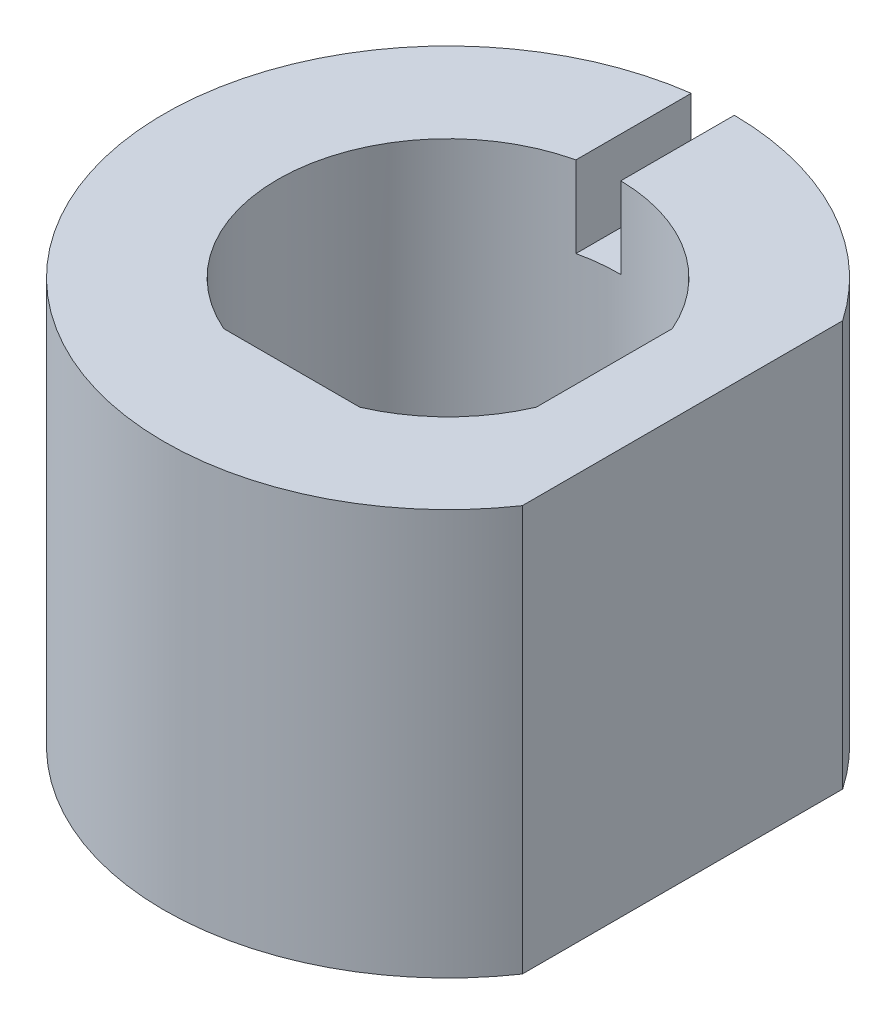
ISO-10303-21;
HEADER;
FILE_DESCRIPTION(('STEP AP214'),'2;1');
FILE_NAME('part.step','',(''),(''),'','','');
FILE_SCHEMA(('AUTOMOTIVE_DESIGN { 1 0 10303 214 1 1 1 1 }'));
ENDSEC;
DATA;
#1=APPLICATION_CONTEXT('core data for automotive mechanical design processes');
#2=APPLICATION_PROTOCOL_DEFINITION('international standard','automotive_design',2000,#1);
#3=PRODUCT_CONTEXT('',#1,'mechanical');
#4=PRODUCT('Part','Part','',(#3));
#5=PRODUCT_RELATED_PRODUCT_CATEGORY('part','',(#4));
#6=PRODUCT_DEFINITION_FORMATION('','',#4);
#7=PRODUCT_DEFINITION_CONTEXT('part definition',#1,'design');
#8=PRODUCT_DEFINITION('design','',#6,#7);
#9=PRODUCT_DEFINITION_SHAPE('','',#8);
#10=(LENGTH_UNIT() NAMED_UNIT(*) SI_UNIT(.MILLI.,.METRE.));
#11=(NAMED_UNIT(*) PLANE_ANGLE_UNIT() SI_UNIT($,.RADIAN.));
#12=(NAMED_UNIT(*) SI_UNIT($,.STERADIAN.) SOLID_ANGLE_UNIT());
#13=UNCERTAINTY_MEASURE_WITH_UNIT(LENGTH_MEASURE(1.E-05),#10,'distance_accuracy_value','');
#14=(GEOMETRIC_REPRESENTATION_CONTEXT(3) GLOBAL_UNCERTAINTY_ASSIGNED_CONTEXT((#13)) GLOBAL_UNIT_ASSIGNED_CONTEXT((#10,
#11,#12)) REPRESENTATION_CONTEXT('',''));
#15=CARTESIAN_POINT('',(0.,0.,0.));
#16=DIRECTION('',(0.,0.,1.));
#17=DIRECTION('',(1.,0.,0.));
#18=AXIS2_PLACEMENT_3D('',#15,#16,#17);
#19=CARTESIAN_POINT('',(0.,10.,0.));
#20=DIRECTION('',(0.,-1.,0.));
#21=DIRECTION('',(0.,0.,-1.));
#22=AXIS2_PLACEMENT_3D('',#19,#20,#21);
#23=CYLINDRICAL_SURFACE('',#22,7.);
#24=CARTESIAN_POINT('',(0.,10.,0.));
#25=DIRECTION('',(0.,1.,0.));
#26=DIRECTION('',(0.,0.,1.));
#27=AXIS2_PLACEMENT_3D('',#24,#25,#26);
#28=CIRCLE('',#27,7.);
#29=CARTESIAN_POINT('',(5.78003269157615,10.,-3.948572157668));
#30=VERTEX_POINT('',#29);
#31=CARTESIAN_POINT('',(0.0590386500706912,10.,-6.99975102684359));
#32=VERTEX_POINT('',#31);
#33=EDGE_CURVE('E117',#30,#32,#28,.T.);
#34=ORIENTED_EDGE('',*,*,#33,.F.);
#35=DIRECTION('',(0.,-1.,0.));
#36=VECTOR('',#35,1.);
#37=CARTESIAN_POINT('',(5.78003269157615,10.,-3.948572157668));
#38=LINE('',#37,#36);
#39=CARTESIAN_POINT('',(5.78003269157615,0.,-3.948572157668));
#40=VERTEX_POINT('',#39);
#41=EDGE_CURVE('E106',#30,#40,#38,.T.);
#42=ORIENTED_EDGE('',*,*,#41,.T.);
#43=CARTESIAN_POINT('',(0.,0.,0.));
#44=DIRECTION('',(0.,1.,0.));
#45=DIRECTION('',(0.,0.,1.));
#46=AXIS2_PLACEMENT_3D('',#43,#44,#45);
#47=CIRCLE('',#46,7.);
#48=CARTESIAN_POINT('',(5.78003269157615,0.,3.948572157668));
#49=VERTEX_POINT('',#48);
#50=EDGE_CURVE('E115',#40,#49,#47,.T.);
#51=ORIENTED_EDGE('',*,*,#50,.T.);
#52=DIRECTION('',(0.,-1.,0.));
#53=VECTOR('',#52,1.);
#54=CARTESIAN_POINT('',(5.78003269157615,10.,3.948572157668));
#55=LINE('',#54,#53);
#56=CARTESIAN_POINT('',(5.78003269157615,10.,3.948572157668));
#57=VERTEX_POINT('',#56);
#58=EDGE_CURVE('E45',#49,#57,#55,.F.);
#59=ORIENTED_EDGE('',*,*,#58,.T.);
#60=CARTESIAN_POINT('',(-0.940961349929308,10.,-6.93646824673329));
#61=VERTEX_POINT('',#60);
#62=EDGE_CURVE('E124',#61,#57,#28,.T.);
#63=ORIENTED_EDGE('',*,*,#62,.F.);
#64=DIRECTION('',(0.,-1.,0.));
#65=VECTOR('',#64,1.);
#66=CARTESIAN_POINT('',(-0.940961349929308,10.,-6.93646824673329));
#67=LINE('',#66,#65);
#68=CARTESIAN_POINT('',(-0.940961349929308,8.,-6.93646824673329));
#69=VERTEX_POINT('',#68);
#70=EDGE_CURVE('E166',#61,#69,#67,.T.);
#71=ORIENTED_EDGE('',*,*,#70,.T.);
#72=CARTESIAN_POINT('',(0.,8.,0.));
#73=DIRECTION('',(0.,1.,0.));
#74=DIRECTION('',(0.,0.,1.));
#75=AXIS2_PLACEMENT_3D('',#72,#73,#74);
#76=CIRCLE('',#75,7.);
#77=CARTESIAN_POINT('',(0.0590386500706912,8.,-6.99975102684358));
#78=VERTEX_POINT('',#77);
#79=EDGE_CURVE('E199',#78,#69,#76,.T.);
#80=ORIENTED_EDGE('',*,*,#79,.F.);
#81=DIRECTION('',(0.,-1.,0.));
#82=VECTOR('',#81,1.);
#83=CARTESIAN_POINT('',(0.0590386500706912,10.,-6.99975102684358));
#84=LINE('',#83,#82);
#85=EDGE_CURVE('E197',#78,#32,#84,.F.);
#86=ORIENTED_EDGE('',*,*,#85,.T.);
#87=EDGE_LOOP('',(#34,#42,#51,#59,#63,#71,#80,#86));
#88=FACE_BOUND('',#87,.T.);
#89=ADVANCED_FACE('F31',(#88),#23,.T.);
#90=CARTESIAN_POINT('',(0.,10.,0.));
#91=DIRECTION('',(0.,1.,0.));
#92=DIRECTION('',(0.,0.,1.));
#93=AXIS2_PLACEMENT_3D('',#90,#91,#92);
#94=PLANE('',#93);
#95=DIRECTION('',(0.,0.,1.));
#96=VECTOR('',#95,1.);
#97=CARTESIAN_POINT('',(5.78003269157615,10.,-12.0814141015945));
#98=LINE('',#97,#96);
#99=EDGE_CURVE('E111',#30,#57,#98,.T.);
#100=ORIENTED_EDGE('',*,*,#99,.F.);
#101=ORIENTED_EDGE('',*,*,#33,.T.);
#102=DIRECTION('',(0.,0.,-1.));
#103=VECTOR('',#102,1.);
#104=CARTESIAN_POINT('',(0.0590386500706909,10.,-9.02524610751527));
#105=LINE('',#104,#103);
#106=CARTESIAN_POINT('',(0.0590386500706915,10.,-4.19958503161894));
#107=VERTEX_POINT('',#106);
#108=EDGE_CURVE('E138',#107,#32,#105,.T.);
#109=ORIENTED_EDGE('',*,*,#108,.F.);
#110=CARTESIAN_POINT('',(0.,10.,0.));
#111=DIRECTION('',(0.,1.,0.));
#112=DIRECTION('',(0.,0.,1.));
#113=AXIS2_PLACEMENT_3D('',#110,#111,#112);
#114=CIRCLE('',#113,4.2);
#115=CARTESIAN_POINT('',(3.85,10.,-1.67854103315945));
#116=VERTEX_POINT('',#115);
#117=EDGE_CURVE('E147',#116,#107,#114,.T.);
#118=ORIENTED_EDGE('',*,*,#117,.F.);
#119=DIRECTION('',(0.,0.,-1.));
#120=VECTOR('',#119,1.);
#121=CARTESIAN_POINT('',(3.85,10.,1.67854103315945));
#122=LINE('',#121,#120);
#123=CARTESIAN_POINT('',(3.85,10.,1.67854103315945));
#124=VERTEX_POINT('',#123);
#125=EDGE_CURVE('E158',#124,#116,#122,.T.);
#126=ORIENTED_EDGE('',*,*,#125,.F.);
#127=CARTESIAN_POINT('',(0.,10.,0.));
#128=DIRECTION('',(0.,1.,0.));
#129=DIRECTION('',(0.,0.,1.));
#130=AXIS2_PLACEMENT_3D('',#127,#128,#129);
#131=CIRCLE('',#130,4.2);
#132=CARTESIAN_POINT('',(1.67854103315945,10.,3.85));
#133=VERTEX_POINT('',#132);
#134=EDGE_CURVE('E175',#133,#124,#131,.T.);
#135=ORIENTED_EDGE('',*,*,#134,.F.);
#136=DIRECTION('',(1.,0.,0.));
#137=VECTOR('',#136,1.);
#138=CARTESIAN_POINT('',(1.67854103315945,10.,3.85));
#139=LINE('',#138,#137);
#140=CARTESIAN_POINT('',(-1.67854103315945,10.,3.85));
#141=VERTEX_POINT('',#140);
#142=EDGE_CURVE('E153',#141,#133,#139,.T.);
#143=ORIENTED_EDGE('',*,*,#142,.F.);
#144=CARTESIAN_POINT('',(-0.940961349929308,10.,-4.09323731756897));
#145=VERTEX_POINT('',#144);
#146=EDGE_CURVE('E154',#145,#141,#114,.T.);
#147=ORIENTED_EDGE('',*,*,#146,.F.);
#148=DIRECTION('',(0.,0.,1.));
#149=VECTOR('',#148,1.);
#150=CARTESIAN_POINT('',(-0.940961349929308,10.,-9.02524610751527));
#151=LINE('',#150,#149);
#152=EDGE_CURVE('E118',#61,#145,#151,.T.);
#153=ORIENTED_EDGE('',*,*,#152,.F.);
#154=ORIENTED_EDGE('',*,*,#62,.T.);
#155=EDGE_LOOP('',(#100,#101,#109,#118,#126,#135,#143,#147,#153,#154));
#156=FACE_BOUND('',#155,.T.);
#157=ADVANCED_FACE('F145',(#156),#94,.T.);
#158=CARTESIAN_POINT('',(0.,0.,0.));
#159=DIRECTION('',(0.,1.,0.));
#160=DIRECTION('',(0.,0.,1.));
#161=AXIS2_PLACEMENT_3D('',#158,#159,#160);
#162=PLANE('',#161);
#163=ORIENTED_EDGE('',*,*,#50,.F.);
#164=DIRECTION('',(0.,0.,1.));
#165=VECTOR('',#164,1.);
#166=CARTESIAN_POINT('',(5.78003269157615,0.,-12.0814141015945));
#167=LINE('',#166,#165);
#168=EDGE_CURVE('E103',#40,#49,#167,.T.);
#169=ORIENTED_EDGE('',*,*,#168,.T.);
#170=EDGE_LOOP('',(#163,#169));
#171=FACE_BOUND('',#170,.T.);
#172=CARTESIAN_POINT('',(0.,0.,0.));
#173=DIRECTION('',(0.,1.,0.));
#174=DIRECTION('',(0.,0.,1.));
#175=AXIS2_PLACEMENT_3D('',#172,#173,#174);
#176=CIRCLE('',#175,4.2);
#177=CARTESIAN_POINT('',(1.67854103315945,0.,3.85));
#178=VERTEX_POINT('',#177);
#179=CARTESIAN_POINT('',(3.85,0.,1.67854103315945));
#180=VERTEX_POINT('',#179);
#181=EDGE_CURVE('E162',#178,#180,#176,.T.);
#182=ORIENTED_EDGE('',*,*,#181,.T.);
#183=DIRECTION('',(0.,0.,-1.));
#184=VECTOR('',#183,1.);
#185=CARTESIAN_POINT('',(3.85,0.,1.67854103315945));
#186=LINE('',#185,#184);
#187=CARTESIAN_POINT('',(3.85,0.,-1.67854103315945));
#188=VERTEX_POINT('',#187);
#189=EDGE_CURVE('E165',#180,#188,#186,.T.);
#190=ORIENTED_EDGE('',*,*,#189,.T.);
#191=CARTESIAN_POINT('',(0.,0.,0.));
#192=DIRECTION('',(0.,1.,0.));
#193=DIRECTION('',(0.,0.,1.));
#194=AXIS2_PLACEMENT_3D('',#191,#192,#193);
#195=CIRCLE('',#194,4.2);
#196=CARTESIAN_POINT('',(-1.67854103315945,0.,3.85));
#197=VERTEX_POINT('',#196);
#198=EDGE_CURVE('E169',#188,#197,#195,.T.);
#199=ORIENTED_EDGE('',*,*,#198,.T.);
#200=DIRECTION('',(1.,0.,0.));
#201=VECTOR('',#200,1.);
#202=CARTESIAN_POINT('',(1.67854103315945,0.,3.85));
#203=LINE('',#202,#201);
#204=EDGE_CURVE('E172',#197,#178,#203,.T.);
#205=ORIENTED_EDGE('',*,*,#204,.T.);
#206=EDGE_LOOP('',(#182,#190,#199,#205));
#207=FACE_BOUND('',#206,.T.);
#208=ADVANCED_FACE('F120',(#171,#207),#162,.F.);
#209=CARTESIAN_POINT('',(0.,10.,0.));
#210=DIRECTION('',(0.,-1.,0.));
#211=DIRECTION('',(0.,0.,-1.));
#212=AXIS2_PLACEMENT_3D('',#209,#210,#211);
#213=CYLINDRICAL_SURFACE('',#212,4.2);
#214=ORIENTED_EDGE('',*,*,#181,.F.);
#215=DIRECTION('',(0.,-1.,0.));
#216=VECTOR('',#215,1.);
#217=CARTESIAN_POINT('',(1.67854103315945,10.,3.85));
#218=LINE('',#217,#216);
#219=EDGE_CURVE('E156',#133,#178,#218,.T.);
#220=ORIENTED_EDGE('',*,*,#219,.F.);
#221=ORIENTED_EDGE('',*,*,#134,.T.);
#222=DIRECTION('',(0.,-1.,0.));
#223=VECTOR('',#222,1.);
#224=CARTESIAN_POINT('',(3.85,10.,1.67854103315945));
#225=LINE('',#224,#223);
#226=EDGE_CURVE('E122',#124,#180,#225,.T.);
#227=ORIENTED_EDGE('',*,*,#226,.T.);
#228=EDGE_LOOP('',(#214,#220,#221,#227));
#229=FACE_BOUND('',#228,.T.);
#230=ADVANCED_FACE('F187',(#229),#213,.F.);
#231=CARTESIAN_POINT('',(3.85,10.,1.67854103315945));
#232=DIRECTION('',(-1.,0.,0.));
#233=DIRECTION('',(0.,0.,1.));
#234=AXIS2_PLACEMENT_3D('',#231,#232,#233);
#235=PLANE('',#234);
#236=ORIENTED_EDGE('',*,*,#189,.F.);
#237=ORIENTED_EDGE('',*,*,#226,.F.);
#238=ORIENTED_EDGE('',*,*,#125,.T.);
#239=DIRECTION('',(0.,-1.,0.));
#240=VECTOR('',#239,1.);
#241=CARTESIAN_POINT('',(3.85,10.,-1.67854103315945));
#242=LINE('',#241,#240);
#243=EDGE_CURVE('E127',#116,#188,#242,.T.);
#244=ORIENTED_EDGE('',*,*,#243,.T.);
#245=EDGE_LOOP('',(#236,#237,#238,#244));
#246=FACE_BOUND('',#245,.T.);
#247=ADVANCED_FACE('F181',(#246),#235,.T.);
#248=CARTESIAN_POINT('',(0.,10.,0.));
#249=DIRECTION('',(0.,-1.,0.));
#250=DIRECTION('',(0.,0.,-1.));
#251=AXIS2_PLACEMENT_3D('',#248,#249,#250);
#252=CYLINDRICAL_SURFACE('',#251,4.2);
#253=DIRECTION('',(0.,-1.,0.));
#254=VECTOR('',#253,1.);
#255=CARTESIAN_POINT('',(-0.940961349929308,10.,-4.09323731756897));
#256=LINE('',#255,#254);
#257=CARTESIAN_POINT('',(-0.940961349929308,8.,-4.09323731756897));
#258=VERTEX_POINT('',#257);
#259=EDGE_CURVE('E11',#145,#258,#256,.T.);
#260=ORIENTED_EDGE('',*,*,#259,.F.);
#261=ORIENTED_EDGE('',*,*,#146,.T.);
#262=DIRECTION('',(0.,-1.,0.));
#263=VECTOR('',#262,1.);
#264=CARTESIAN_POINT('',(-1.67854103315945,10.,3.85));
#265=LINE('',#264,#263);
#266=EDGE_CURVE('E178',#141,#197,#265,.T.);
#267=ORIENTED_EDGE('',*,*,#266,.T.);
#268=ORIENTED_EDGE('',*,*,#198,.F.);
#269=ORIENTED_EDGE('',*,*,#243,.F.);
#270=ORIENTED_EDGE('',*,*,#117,.T.);
#271=DIRECTION('',(0.,-1.,0.));
#272=VECTOR('',#271,1.);
#273=CARTESIAN_POINT('',(0.0590386500706915,10.,-4.19958503161894));
#274=LINE('',#273,#272);
#275=CARTESIAN_POINT('',(0.0590386500706915,8.,-4.19958503161894));
#276=VERTEX_POINT('',#275);
#277=EDGE_CURVE('E38',#276,#107,#274,.F.);
#278=ORIENTED_EDGE('',*,*,#277,.F.);
#279=CARTESIAN_POINT('',(0.,8.,0.));
#280=DIRECTION('',(0.,1.,0.));
#281=DIRECTION('',(0.,0.,1.));
#282=AXIS2_PLACEMENT_3D('',#279,#280,#281);
#283=CIRCLE('',#282,4.2);
#284=EDGE_CURVE('E130',#276,#258,#283,.T.);
#285=ORIENTED_EDGE('',*,*,#284,.T.);
#286=EDGE_LOOP('',(#260,#261,#267,#268,#269,#270,#278,#285));
#287=FACE_BOUND('',#286,.T.);
#288=ADVANCED_FACE('F151',(#287),#252,.F.);
#289=CARTESIAN_POINT('',(1.67854103315945,10.,3.85));
#290=DIRECTION('',(0.,0.,-1.));
#291=DIRECTION('',(-1.,0.,0.));
#292=AXIS2_PLACEMENT_3D('',#289,#290,#291);
#293=PLANE('',#292);
#294=ORIENTED_EDGE('',*,*,#204,.F.);
#295=ORIENTED_EDGE('',*,*,#266,.F.);
#296=ORIENTED_EDGE('',*,*,#142,.T.);
#297=ORIENTED_EDGE('',*,*,#219,.T.);
#298=EDGE_LOOP('',(#294,#295,#296,#297));
#299=FACE_BOUND('',#298,.T.);
#300=ADVANCED_FACE('F190',(#299),#293,.T.);
#301=CARTESIAN_POINT('',(-0.940961349929308,8.,-9.02524610751527));
#302=DIRECTION('',(-1.,0.,0.));
#303=DIRECTION('',(0.,0.,1.));
#304=AXIS2_PLACEMENT_3D('',#301,#302,#303);
#305=PLANE('',#304);
#306=ORIENTED_EDGE('',*,*,#152,.T.);
#307=ORIENTED_EDGE('',*,*,#259,.T.);
#308=DIRECTION('',(0.,0.,1.));
#309=VECTOR('',#308,1.);
#310=CARTESIAN_POINT('',(-0.940961349929308,8.,-9.02524610751527));
#311=LINE('',#310,#309);
#312=EDGE_CURVE('E53',#69,#258,#311,.T.);
#313=ORIENTED_EDGE('',*,*,#312,.F.);
#314=ORIENTED_EDGE('',*,*,#70,.F.);
#315=EDGE_LOOP('',(#306,#307,#313,#314));
#316=FACE_BOUND('',#315,.T.);
#317=ADVANCED_FACE('F208',(#316),#305,.F.);
#318=CARTESIAN_POINT('',(0.0590386500706909,8.,-9.02524610751527));
#319=DIRECTION('',(1.,0.,0.));
#320=DIRECTION('',(0.,0.,-1.));
#321=AXIS2_PLACEMENT_3D('',#318,#319,#320);
#322=PLANE('',#321);
#323=DIRECTION('',(0.,0.,-1.));
#324=VECTOR('',#323,1.);
#325=CARTESIAN_POINT('',(0.0590386500706909,8.,-9.02524610751527));
#326=LINE('',#325,#324);
#327=EDGE_CURVE('E140',#276,#78,#326,.T.);
#328=ORIENTED_EDGE('',*,*,#327,.F.);
#329=ORIENTED_EDGE('',*,*,#277,.T.);
#330=ORIENTED_EDGE('',*,*,#108,.T.);
#331=ORIENTED_EDGE('',*,*,#85,.F.);
#332=EDGE_LOOP('',(#328,#329,#330,#331));
#333=FACE_BOUND('',#332,.T.);
#334=ADVANCED_FACE('F137',(#333),#322,.F.);
#335=CARTESIAN_POINT('',(-0.940961349929308,8.,-2.29212599555943));
#336=DIRECTION('',(0.,1.,0.));
#337=DIRECTION('',(0.,0.,1.));
#338=AXIS2_PLACEMENT_3D('',#335,#336,#337);
#339=PLANE('',#338);
#340=ORIENTED_EDGE('',*,*,#79,.T.);
#341=ORIENTED_EDGE('',*,*,#312,.T.);
#342=ORIENTED_EDGE('',*,*,#284,.F.);
#343=ORIENTED_EDGE('',*,*,#327,.T.);
#344=EDGE_LOOP('',(#340,#341,#342,#343));
#345=FACE_BOUND('',#344,.T.);
#346=ADVANCED_FACE('F209',(#345),#339,.T.);
#347=CARTESIAN_POINT('',(5.78003269157615,0.,-12.0814141015945));
#348=DIRECTION('',(-1.,0.,0.));
#349=DIRECTION('',(0.,0.,1.));
#350=AXIS2_PLACEMENT_3D('',#347,#348,#349);
#351=PLANE('',#350);
#352=ORIENTED_EDGE('',*,*,#99,.T.);
#353=ORIENTED_EDGE('',*,*,#58,.F.);
#354=ORIENTED_EDGE('',*,*,#168,.F.);
#355=ORIENTED_EDGE('',*,*,#41,.F.);
#356=EDGE_LOOP('',(#352,#353,#354,#355));
#357=FACE_BOUND('',#356,.T.);
#358=ADVANCED_FACE('F105',(#357),#351,.F.);
#359=CLOSED_SHELL('',(#89,#157,#208,#230,#247,#288,#300,#317,#334,#346,#358));
#360=MANIFOLD_SOLID_BREP('B2',#359);
#361=ADVANCED_BREP_SHAPE_REPRESENTATION('',(#18,#360),#14);
#362=SHAPE_DEFINITION_REPRESENTATION(#9,#361);
ENDSEC;
END-ISO-10303-21;
